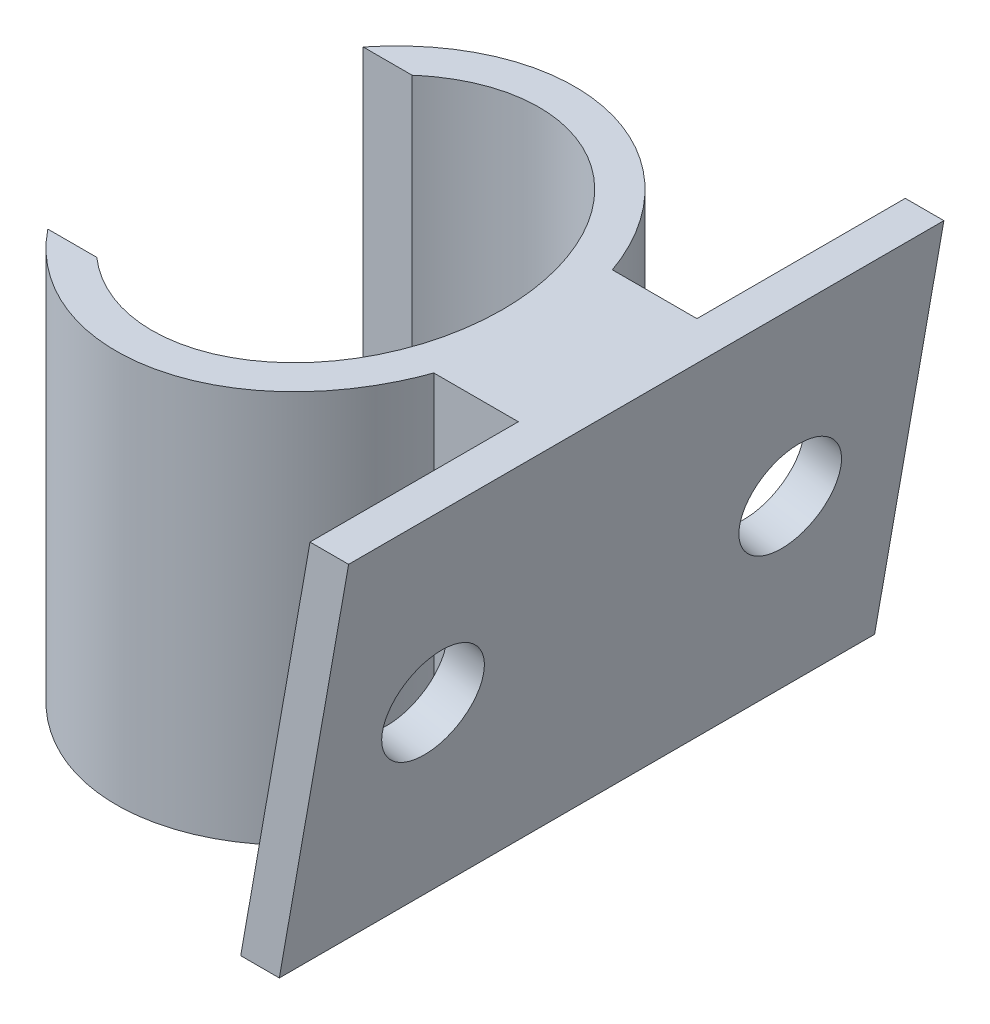
ISO-10303-21;
HEADER;
FILE_DESCRIPTION(('STEP AP214'),'2;1');
FILE_NAME('part.step','',(''),(''),'','','');
FILE_SCHEMA(('AUTOMOTIVE_DESIGN { 1 0 10303 214 1 1 1 1 }'));
ENDSEC;
DATA;
#1=APPLICATION_CONTEXT('core data for automotive mechanical design processes');
#2=APPLICATION_PROTOCOL_DEFINITION('international standard','automotive_design',2000,#1);
#3=PRODUCT_CONTEXT('',#1,'mechanical');
#4=PRODUCT('Part','Part','',(#3));
#5=PRODUCT_RELATED_PRODUCT_CATEGORY('part','',(#4));
#6=PRODUCT_DEFINITION_FORMATION('','',#4);
#7=PRODUCT_DEFINITION_CONTEXT('part definition',#1,'design');
#8=PRODUCT_DEFINITION('design','',#6,#7);
#9=PRODUCT_DEFINITION_SHAPE('','',#8);
#10=(LENGTH_UNIT() NAMED_UNIT(*) SI_UNIT(.MILLI.,.METRE.));
#11=(NAMED_UNIT(*) PLANE_ANGLE_UNIT() SI_UNIT($,.RADIAN.));
#12=(NAMED_UNIT(*) SI_UNIT($,.STERADIAN.) SOLID_ANGLE_UNIT());
#13=UNCERTAINTY_MEASURE_WITH_UNIT(LENGTH_MEASURE(1.E-05),#10,'distance_accuracy_value','');
#14=(GEOMETRIC_REPRESENTATION_CONTEXT(3) GLOBAL_UNCERTAINTY_ASSIGNED_CONTEXT((#13)) GLOBAL_UNIT_ASSIGNED_CONTEXT((#10,
#11,#12)) REPRESENTATION_CONTEXT('',''));
#15=CARTESIAN_POINT('',(0.,0.,0.));
#16=DIRECTION('',(0.,0.,1.));
#17=DIRECTION('',(1.,0.,0.));
#18=AXIS2_PLACEMENT_3D('',#15,#16,#17);
#19=CARTESIAN_POINT('',(13.6262926810581,0.,7.5));
#20=DIRECTION('',(0.,0.,1.));
#21=DIRECTION('',(1.,0.,0.));
#22=AXIS2_PLACEMENT_3D('',#19,#20,#21);
#23=PLANE('',#22);
#24=DIRECTION('',(1.,0.,0.));
#25=VECTOR('',#24,1.);
#26=CARTESIAN_POINT('',(13.6262926810581,0.,7.5));
#27=LINE('',#26,#25);
#28=CARTESIAN_POINT('',(14.9198723404759,0.,7.5));
#29=VERTEX_POINT('',#28);
#30=CARTESIAN_POINT('',(16.2,2.03165817409602E-13,7.5));
#31=VERTEX_POINT('',#30);
#32=EDGE_CURVE('E200',#29,#31,#27,.T.);
#33=ORIENTED_EDGE('',*,*,#32,.T.);
#34=DIRECTION('',(0.173648177666924,0.984807753012209,0.));
#35=VECTOR('',#34,1.);
#36=CARTESIAN_POINT('',(16.2,2.03165817409602E-13,7.5));
#37=LINE('',#36,#35);
#38=CARTESIAN_POINT('',(22.0187903633791,33.,7.5));
#39=VERTEX_POINT('',#38);
#40=EDGE_CURVE('E157',#31,#39,#37,.T.);
#41=ORIENTED_EDGE('',*,*,#40,.T.);
#42=DIRECTION('',(1.,0.,0.));
#43=VECTOR('',#42,1.);
#44=CARTESIAN_POINT('',(13.6262926810581,33.,7.5));
#45=LINE('',#44,#43);
#46=CARTESIAN_POINT('',(14.9198723404759,33.,7.5));
#47=VERTEX_POINT('',#46);
#48=EDGE_CURVE('E142',#47,#39,#45,.T.);
#49=ORIENTED_EDGE('',*,*,#48,.F.);
#50=DIRECTION('',(0.,-1.,0.));
#51=VECTOR('',#50,1.);
#52=CARTESIAN_POINT('',(14.9198723404759,33.,7.5));
#53=LINE('',#52,#51);
#54=EDGE_CURVE('E11',#29,#47,#53,.F.);
#55=ORIENTED_EDGE('',*,*,#54,.F.);
#56=EDGE_LOOP('',(#33,#41,#49,#55));
#57=FACE_BOUND('',#56,.T.);
#58=ADVANCED_FACE('F39',(#57),#23,.T.);
#59=CARTESIAN_POINT('',(17.8184577548668,0.,-7.5));
#60=DIRECTION('',(0.,0.,-1.));
#61=DIRECTION('',(-1.,0.,0.));
#62=AXIS2_PLACEMENT_3D('',#59,#60,#61);
#63=PLANE('',#62);
#64=DIRECTION('',(-1.,0.,0.));
#65=VECTOR('',#64,1.);
#66=CARTESIAN_POINT('',(17.8184577548668,33.,-7.5));
#67=LINE('',#66,#65);
#68=CARTESIAN_POINT('',(22.0187903633796,33.,-7.5));
#69=VERTEX_POINT('',#68);
#70=CARTESIAN_POINT('',(14.9198723404759,33.,-7.5));
#71=VERTEX_POINT('',#70);
#72=EDGE_CURVE('E134',#69,#71,#67,.T.);
#73=ORIENTED_EDGE('',*,*,#72,.F.);
#74=DIRECTION('',(-0.173648177666938,-0.984807753012207,0.));
#75=VECTOR('',#74,1.);
#76=CARTESIAN_POINT('',(16.2,2.03165817409602E-13,-7.5));
#77=LINE('',#76,#75);
#78=CARTESIAN_POINT('',(16.2,2.03165817409602E-13,-7.5));
#79=VERTEX_POINT('',#78);
#80=EDGE_CURVE('E136',#69,#79,#77,.T.);
#81=ORIENTED_EDGE('',*,*,#80,.T.);
#82=DIRECTION('',(-1.,0.,0.));
#83=VECTOR('',#82,1.);
#84=CARTESIAN_POINT('',(17.8184577548668,0.,-7.5));
#85=LINE('',#84,#83);
#86=CARTESIAN_POINT('',(14.9198723404759,0.,-7.5));
#87=VERTEX_POINT('',#86);
#88=EDGE_CURVE('E197',#79,#87,#85,.T.);
#89=ORIENTED_EDGE('',*,*,#88,.T.);
#90=DIRECTION('',(0.,-1.,0.));
#91=VECTOR('',#90,1.);
#92=CARTESIAN_POINT('',(14.9198723404759,33.,-7.5));
#93=LINE('',#92,#91);
#94=EDGE_CURVE('E50',#71,#87,#93,.T.);
#95=ORIENTED_EDGE('',*,*,#94,.F.);
#96=EDGE_LOOP('',(#73,#81,#89,#95));
#97=FACE_BOUND('',#96,.T.);
#98=ADVANCED_FACE('F135',(#97),#63,.T.);
#99=CARTESIAN_POINT('',(0.,33.,0.));
#100=DIRECTION('',(0.,1.,0.));
#101=DIRECTION('',(0.,0.,1.));
#102=AXIS2_PLACEMENT_3D('',#99,#100,#101);
#103=ELLIPSE('',#102,19.25,16.2);
#104=DIRECTION('',(0.,-1.,0.));
#105=VECTOR('',#104,1.);
#106=SURFACE_OF_LINEAR_EXTRUSION('',#103,#105);
#107=CARTESIAN_POINT('',(0.,0.,0.));
#108=DIRECTION('',(0.,1.,0.));
#109=DIRECTION('',(0.,0.,1.));
#110=AXIS2_PLACEMENT_3D('',#107,#108,#109);
#111=ELLIPSE('',#110,19.25,16.2);
#112=CARTESIAN_POINT('',(-11.7555055635405,0.,13.2452627548072));
#113=VERTEX_POINT('',#112);
#114=EDGE_CURVE('E291',#113,#29,#111,.T.);
#115=ORIENTED_EDGE('',*,*,#114,.T.);
#116=ORIENTED_EDGE('',*,*,#54,.T.);
#117=CARTESIAN_POINT('',(-11.7555055635405,33.,13.2452627548072));
#118=VERTEX_POINT('',#117);
#119=EDGE_CURVE('E296',#118,#47,#103,.T.);
#120=ORIENTED_EDGE('',*,*,#119,.F.);
#121=DIRECTION('',(0.,-1.,0.));
#122=VECTOR('',#121,1.);
#123=CARTESIAN_POINT('',(-11.7555055635405,33.,13.2452627548072));
#124=LINE('',#123,#122);
#125=EDGE_CURVE('E232',#118,#113,#124,.T.);
#126=ORIENTED_EDGE('',*,*,#125,.T.);
#127=EDGE_LOOP('',(#115,#116,#120,#126));
#128=FACE_BOUND('',#127,.T.);
#129=ADVANCED_FACE('F253',(#128),#106,.F.);
#130=CARTESIAN_POINT('',(0.,33.,0.));
#131=DIRECTION('',(0.,1.,0.));
#132=DIRECTION('',(0.,0.,1.));
#133=AXIS2_PLACEMENT_3D('',#130,#131,#132);
#134=PLANE('',#133);
#135=DIRECTION('',(0.,0.,-1.));
#136=VECTOR('',#135,1.);
#137=CARTESIAN_POINT('',(22.0187903633796,33.,-7.5));
#138=LINE('',#137,#136);
#139=CARTESIAN_POINT('',(22.0187903633796,33.,-25.));
#140=VERTEX_POINT('',#139);
#141=EDGE_CURVE('E58',#69,#140,#138,.T.);
#142=ORIENTED_EDGE('',*,*,#141,.F.);
#143=ORIENTED_EDGE('',*,*,#72,.T.);
#144=CARTESIAN_POINT('',(-11.7555055635405,33.,-13.2452627548072));
#145=VERTEX_POINT('',#144);
#146=EDGE_CURVE('E287',#71,#145,#103,.T.);
#147=ORIENTED_EDGE('',*,*,#146,.T.);
#148=DIRECTION('',(-1.,0.,0.));
#149=VECTOR('',#148,1.);
#150=CARTESIAN_POINT('',(-7.64715601697513,33.,-13.2452627548072));
#151=LINE('',#150,#149);
#152=CARTESIAN_POINT('',(-7.64715601697513,33.,-13.2452627548072));
#153=VERTEX_POINT('',#152);
#154=EDGE_CURVE('E203',#153,#145,#151,.T.);
#155=ORIENTED_EDGE('',*,*,#154,.F.);
#156=CARTESIAN_POINT('',(0.,33.,0.));
#157=DIRECTION('',(0.,1.,0.));
#158=DIRECTION('',(0.,0.,1.));
#159=AXIS2_PLACEMENT_3D('',#156,#157,#158);
#160=ELLIPSE('',#159,16.25,13.2);
#161=CARTESIAN_POINT('',(-7.64715601697507,33.,13.2452627548072));
#162=VERTEX_POINT('',#161);
#163=EDGE_CURVE('E237',#162,#153,#160,.T.);
#164=ORIENTED_EDGE('',*,*,#163,.F.);
#165=DIRECTION('',(1.,0.,0.));
#166=VECTOR('',#165,1.);
#167=CARTESIAN_POINT('',(-7.64715601697507,33.,13.2452627548072));
#168=LINE('',#167,#166);
#169=EDGE_CURVE('E212',#118,#162,#168,.T.);
#170=ORIENTED_EDGE('',*,*,#169,.F.);
#171=ORIENTED_EDGE('',*,*,#119,.T.);
#172=ORIENTED_EDGE('',*,*,#48,.T.);
#173=DIRECTION('',(0.,0.,1.));
#174=VECTOR('',#173,1.);
#175=CARTESIAN_POINT('',(22.0187903633791,33.,7.5));
#176=LINE('',#175,#174);
#177=CARTESIAN_POINT('',(22.0187903633791,33.,25.));
#178=VERTEX_POINT('',#177);
#179=EDGE_CURVE('E163',#39,#178,#176,.T.);
#180=ORIENTED_EDGE('',*,*,#179,.T.);
#181=DIRECTION('',(-1.,0.,0.));
#182=VECTOR('',#181,1.);
#183=CARTESIAN_POINT('',(16.2,33.,25.));
#184=LINE('',#183,#182);
#185=CARTESIAN_POINT('',(25.2620960188586,33.,25.));
#186=VERTEX_POINT('',#185);
#187=EDGE_CURVE('E188',#186,#178,#184,.T.);
#188=ORIENTED_EDGE('',*,*,#187,.F.);
#189=DIRECTION('',(0.,0.,-1.));
#190=VECTOR('',#189,1.);
#191=CARTESIAN_POINT('',(25.2620960188586,33.,25.));
#192=LINE('',#191,#190);
#193=CARTESIAN_POINT('',(25.2620960188586,33.,-25.));
#194=VERTEX_POINT('',#193);
#195=EDGE_CURVE('E182',#186,#194,#192,.T.);
#196=ORIENTED_EDGE('',*,*,#195,.T.);
#197=DIRECTION('',(1.,0.,0.));
#198=VECTOR('',#197,1.);
#199=CARTESIAN_POINT('',(16.2,33.,-25.));
#200=LINE('',#199,#198);
#201=EDGE_CURVE('E152',#140,#194,#200,.T.);
#202=ORIENTED_EDGE('',*,*,#201,.F.);
#203=EDGE_LOOP('',(#142,#143,#147,#155,#164,#170,#171,#172,#180,#188,#196,#202));
#204=FACE_BOUND('',#203,.T.);
#205=ADVANCED_FACE('F150',(#204),#134,.T.);
#206=CARTESIAN_POINT('',(0.,0.,0.));
#207=DIRECTION('',(0.,1.,0.));
#208=DIRECTION('',(0.,0.,1.));
#209=AXIS2_PLACEMENT_3D('',#206,#207,#208);
#210=PLANE('',#209);
#211=ORIENTED_EDGE('',*,*,#88,.F.);
#212=DIRECTION('',(0.,0.,1.));
#213=VECTOR('',#212,1.);
#214=CARTESIAN_POINT('',(16.2,0.,-30.));
#215=LINE('',#214,#213);
#216=CARTESIAN_POINT('',(16.2,2.03165817409602E-13,-25.));
#217=VERTEX_POINT('',#216);
#218=EDGE_CURVE('E143',#217,#79,#215,.T.);
#219=ORIENTED_EDGE('',*,*,#218,.F.);
#220=DIRECTION('',(-1.,0.,0.));
#221=VECTOR('',#220,1.);
#222=CARTESIAN_POINT('',(16.2,2.03165817409602E-13,-25.));
#223=LINE('',#222,#221);
#224=CARTESIAN_POINT('',(19.4433056554793,2.03721588210026E-13,-25.));
#225=VERTEX_POINT('',#224);
#226=EDGE_CURVE('E66',#225,#217,#223,.T.);
#227=ORIENTED_EDGE('',*,*,#226,.F.);
#228=DIRECTION('',(0.,0.,1.));
#229=VECTOR('',#228,1.);
#230=CARTESIAN_POINT('',(19.4433056554793,0.,-25.));
#231=LINE('',#230,#229);
#232=CARTESIAN_POINT('',(19.4433056554793,0.,25.));
#233=VERTEX_POINT('',#232);
#234=EDGE_CURVE('E171',#225,#233,#231,.T.);
#235=ORIENTED_EDGE('',*,*,#234,.T.);
#236=DIRECTION('',(-1.,0.,0.));
#237=VECTOR('',#236,1.);
#238=CARTESIAN_POINT('',(16.2,2.03165817409602E-13,25.));
#239=LINE('',#238,#237);
#240=CARTESIAN_POINT('',(16.2,2.03165817409602E-13,25.));
#241=VERTEX_POINT('',#240);
#242=EDGE_CURVE('E168',#233,#241,#239,.T.);
#243=ORIENTED_EDGE('',*,*,#242,.T.);
#244=EDGE_CURVE('E191',#31,#241,#215,.T.);
#245=ORIENTED_EDGE('',*,*,#244,.F.);
#246=ORIENTED_EDGE('',*,*,#32,.F.);
#247=ORIENTED_EDGE('',*,*,#114,.F.);
#248=DIRECTION('',(1.,0.,0.));
#249=VECTOR('',#248,1.);
#250=CARTESIAN_POINT('',(-7.64715601697507,0.,13.2452627548072));
#251=LINE('',#250,#249);
#252=CARTESIAN_POINT('',(-7.64715601697507,0.,13.2452627548072));
#253=VERTEX_POINT('',#252);
#254=EDGE_CURVE('E211',#113,#253,#251,.T.);
#255=ORIENTED_EDGE('',*,*,#254,.T.);
#256=CARTESIAN_POINT('',(0.,0.,0.));
#257=DIRECTION('',(0.,1.,0.));
#258=DIRECTION('',(0.,0.,1.));
#259=AXIS2_PLACEMENT_3D('',#256,#257,#258);
#260=ELLIPSE('',#259,16.25,13.2);
#261=CARTESIAN_POINT('',(-7.64715601697513,0.,-13.2452627548072));
#262=VERTEX_POINT('',#261);
#263=EDGE_CURVE('E236',#253,#262,#260,.T.);
#264=ORIENTED_EDGE('',*,*,#263,.T.);
#265=DIRECTION('',(-1.,0.,0.));
#266=VECTOR('',#265,1.);
#267=CARTESIAN_POINT('',(-7.64715601697513,0.,-13.2452627548072));
#268=LINE('',#267,#266);
#269=CARTESIAN_POINT('',(-11.7555055635405,0.,-13.2452627548072));
#270=VERTEX_POINT('',#269);
#271=EDGE_CURVE('E207',#262,#270,#268,.T.);
#272=ORIENTED_EDGE('',*,*,#271,.T.);
#273=EDGE_CURVE('E242',#87,#270,#111,.T.);
#274=ORIENTED_EDGE('',*,*,#273,.F.);
#275=EDGE_LOOP('',(#211,#219,#227,#235,#243,#245,#246,#247,#255,#264,#272,#274));
#276=FACE_BOUND('',#275,.T.);
#277=ADVANCED_FACE('F252',(#276),#210,.F.);
#278=ORIENTED_EDGE('',*,*,#146,.F.);
#279=ORIENTED_EDGE('',*,*,#94,.T.);
#280=ORIENTED_EDGE('',*,*,#273,.T.);
#281=DIRECTION('',(0.,-1.,0.));
#282=VECTOR('',#281,1.);
#283=CARTESIAN_POINT('',(-11.7555055635405,33.,-13.2452627548072));
#284=LINE('',#283,#282);
#285=EDGE_CURVE('E226',#270,#145,#284,.F.);
#286=ORIENTED_EDGE('',*,*,#285,.T.);
#287=EDGE_LOOP('',(#278,#279,#280,#286));
#288=FACE_BOUND('',#287,.T.);
#289=ADVANCED_FACE('F41',(#288),#106,.F.);
#290=DIRECTION('',(0.,-1.,0.));
#291=VECTOR('',#290,1.);
#292=SURFACE_OF_LINEAR_EXTRUSION('',#160,#291);
#293=DIRECTION('',(0.,1.,0.));
#294=VECTOR('',#293,1.);
#295=CARTESIAN_POINT('',(-7.64715601697507,0.,13.2452627548072));
#296=LINE('',#295,#294);
#297=EDGE_CURVE('E222',#253,#162,#296,.T.);
#298=ORIENTED_EDGE('',*,*,#297,.T.);
#299=ORIENTED_EDGE('',*,*,#163,.T.);
#300=DIRECTION('',(0.,1.,0.));
#301=VECTOR('',#300,1.);
#302=CARTESIAN_POINT('',(-7.64715601697513,0.,-13.2452627548072));
#303=LINE('',#302,#301);
#304=EDGE_CURVE('E216',#262,#153,#303,.T.);
#305=ORIENTED_EDGE('',*,*,#304,.F.);
#306=ORIENTED_EDGE('',*,*,#263,.F.);
#307=EDGE_LOOP('',(#298,#299,#305,#306));
#308=FACE_BOUND('',#307,.T.);
#309=ADVANCED_FACE('F244',(#308),#292,.T.);
#310=CARTESIAN_POINT('',(-7.64715601697513,0.,-13.2452627548072));
#311=DIRECTION('',(0.,0.,-1.));
#312=DIRECTION('',(-1.,0.,0.));
#313=AXIS2_PLACEMENT_3D('',#310,#311,#312);
#314=PLANE('',#313);
#315=ORIENTED_EDGE('',*,*,#271,.F.);
#316=ORIENTED_EDGE('',*,*,#304,.T.);
#317=ORIENTED_EDGE('',*,*,#154,.T.);
#318=ORIENTED_EDGE('',*,*,#285,.F.);
#319=EDGE_LOOP('',(#315,#316,#317,#318));
#320=FACE_BOUND('',#319,.T.);
#321=ADVANCED_FACE('F248',(#320),#314,.F.);
#322=CARTESIAN_POINT('',(-7.64715601697507,0.,13.2452627548072));
#323=DIRECTION('',(0.,0.,1.));
#324=DIRECTION('',(1.,0.,0.));
#325=AXIS2_PLACEMENT_3D('',#322,#323,#324);
#326=PLANE('',#325);
#327=ORIENTED_EDGE('',*,*,#169,.T.);
#328=ORIENTED_EDGE('',*,*,#297,.F.);
#329=ORIENTED_EDGE('',*,*,#254,.F.);
#330=ORIENTED_EDGE('',*,*,#125,.F.);
#331=EDGE_LOOP('',(#327,#328,#329,#330));
#332=FACE_BOUND('',#331,.T.);
#333=ADVANCED_FACE('F269',(#332),#326,.F.);
#334=CARTESIAN_POINT('',(16.2,-3.,25.));
#335=DIRECTION('',(0.,0.,-1.));
#336=DIRECTION('',(-1.,0.,0.));
#337=AXIS2_PLACEMENT_3D('',#334,#335,#336);
#338=PLANE('',#337);
#339=ORIENTED_EDGE('',*,*,#187,.T.);
#340=DIRECTION('',(0.173648177666924,0.984807753012209,0.));
#341=VECTOR('',#340,1.);
#342=CARTESIAN_POINT('',(16.2,2.03165817409602E-13,25.));
#343=LINE('',#342,#341);
#344=EDGE_CURVE('E154',#241,#178,#343,.T.);
#345=ORIENTED_EDGE('',*,*,#344,.F.);
#346=ORIENTED_EDGE('',*,*,#242,.F.);
#347=DIRECTION('',(-0.17364817766693,-0.984807753012208,0.));
#348=VECTOR('',#347,1.);
#349=CARTESIAN_POINT('',(25.0728739543785,31.9268683458431,25.));
#350=LINE('',#349,#348);
#351=EDGE_CURVE('E178',#186,#233,#350,.T.);
#352=ORIENTED_EDGE('',*,*,#351,.F.);
#353=EDGE_LOOP('',(#339,#345,#346,#352));
#354=FACE_BOUND('',#353,.T.);
#355=ADVANCED_FACE('F267',(#354),#338,.F.);
#356=CARTESIAN_POINT('',(16.2,-3.,-25.));
#357=DIRECTION('',(0.,0.,1.));
#358=DIRECTION('',(1.,0.,0.));
#359=AXIS2_PLACEMENT_3D('',#356,#357,#358);
#360=PLANE('',#359);
#361=ORIENTED_EDGE('',*,*,#226,.T.);
#362=DIRECTION('',(-0.173648177666938,-0.984807753012207,0.));
#363=VECTOR('',#362,1.);
#364=CARTESIAN_POINT('',(16.2,2.03165817409602E-13,-25.));
#365=LINE('',#364,#363);
#366=EDGE_CURVE('E147',#140,#217,#365,.T.);
#367=ORIENTED_EDGE('',*,*,#366,.F.);
#368=ORIENTED_EDGE('',*,*,#201,.T.);
#369=DIRECTION('',(-0.173648177666931,-0.984807753012208,0.));
#370=VECTOR('',#369,1.);
#371=CARTESIAN_POINT('',(19.3455080234432,-0.554637932567786,-25.));
#372=LINE('',#371,#370);
#373=EDGE_CURVE('E177',#194,#225,#372,.T.);
#374=ORIENTED_EDGE('',*,*,#373,.T.);
#375=EDGE_LOOP('',(#361,#367,#368,#374));
#376=FACE_BOUND('',#375,.T.);
#377=ADVANCED_FACE('F276',(#376),#360,.F.);
#378=CARTESIAN_POINT('',(19.3455080234432,-0.554637932567786,25.));
#379=DIRECTION('',(0.984807753012208,-0.173648177666931,0.));
#380=DIRECTION('',(0.173648177666931,0.984807753012208,0.));
#381=AXIS2_PLACEMENT_3D('',#378,#379,#380);
#382=PLANE('',#381);
#383=CARTESIAN_POINT('',(22.3526208020492,16.4995460982805,15.));
#384=DIRECTION('',(0.984807753012208,-0.173648177666931,0.));
#385=DIRECTION('',(0.173648177666931,0.984807753012208,0.));
#386=AXIS2_PLACEMENT_3D('',#383,#384,#385);
#387=CIRCLE('',#386,4.25);
#388=CARTESIAN_POINT('',(23.0906255571337,20.6849790485824,15.));
#389=VERTEX_POINT('',#388);
#390=EDGE_CURVE('E302',#389,#389,#387,.T.);
#391=ORIENTED_EDGE('',*,*,#390,.F.);
#392=EDGE_LOOP('',(#391));
#393=FACE_BOUND('',#392,.T.);
#394=CARTESIAN_POINT('',(22.3526208020492,16.4995460982805,-15.));
#395=DIRECTION('',(0.984807753012208,-0.173648177666931,0.));
#396=DIRECTION('',(0.173648177666931,0.984807753012208,0.));
#397=AXIS2_PLACEMENT_3D('',#394,#395,#396);
#398=CIRCLE('',#397,4.24999999999999);
#399=CARTESIAN_POINT('',(23.0906255571337,20.6849790485824,-15.));
#400=VERTEX_POINT('',#399);
#401=EDGE_CURVE('E309',#400,#400,#398,.T.);
#402=ORIENTED_EDGE('',*,*,#401,.F.);
#403=EDGE_LOOP('',(#402));
#404=FACE_BOUND('',#403,.T.);
#405=ORIENTED_EDGE('',*,*,#234,.F.);
#406=ORIENTED_EDGE('',*,*,#373,.F.);
#407=ORIENTED_EDGE('',*,*,#195,.F.);
#408=ORIENTED_EDGE('',*,*,#351,.T.);
#409=EDGE_LOOP('',(#405,#406,#407,#408));
#410=FACE_BOUND('',#409,.T.);
#411=ADVANCED_FACE('F321',(#393,#404,#410),#382,.T.);
#412=CARTESIAN_POINT('',(16.2,2.03165817409602E-13,7.5));
#413=DIRECTION('',(0.984807753012209,-0.173648177666924,0.));
#414=DIRECTION('',(0.173648177666924,0.984807753012209,0.));
#415=AXIS2_PLACEMENT_3D('',#412,#413,#414);
#416=PLANE('',#415);
#417=CARTESIAN_POINT('',(19.2071127786059,17.0541840308485,15.));
#418=DIRECTION('',(0.984807753012209,-0.173648177666924,0.));
#419=DIRECTION('',(0.173648177666924,0.984807753012209,0.));
#420=AXIS2_PLACEMENT_3D('',#417,#418,#419);
#421=CIRCLE('',#420,4.25);
#422=CARTESIAN_POINT('',(19.9451175336903,21.2396169811504,15.));
#423=VERTEX_POINT('',#422);
#424=EDGE_CURVE('E44',#423,#423,#421,.T.);
#425=ORIENTED_EDGE('',*,*,#424,.T.);
#426=EDGE_LOOP('',(#425));
#427=FACE_BOUND('',#426,.T.);
#428=ORIENTED_EDGE('',*,*,#344,.T.);
#429=ORIENTED_EDGE('',*,*,#179,.F.);
#430=ORIENTED_EDGE('',*,*,#40,.F.);
#431=ORIENTED_EDGE('',*,*,#244,.T.);
#432=EDGE_LOOP('',(#428,#429,#430,#431));
#433=FACE_BOUND('',#432,.T.);
#434=ADVANCED_FACE('F324',(#427,#433),#416,.F.);
#435=CARTESIAN_POINT('',(16.2,2.03165817409602E-13,-7.5));
#436=DIRECTION('',(0.984807753012207,-0.173648177666938,0.));
#437=DIRECTION('',(0.173648177666938,0.984807753012207,0.));
#438=AXIS2_PLACEMENT_3D('',#435,#436,#437);
#439=PLANE('',#438);
#440=CARTESIAN_POINT('',(19.2071127786062,17.0541840308485,-15.));
#441=DIRECTION('',(0.984807753012207,-0.173648177666938,0.));
#442=DIRECTION('',(0.173648177666938,0.984807753012207,0.));
#443=AXIS2_PLACEMENT_3D('',#440,#441,#442);
#444=CIRCLE('',#443,4.24999999999999);
#445=CARTESIAN_POINT('',(19.9451175336906,21.2396169811503,-15.));
#446=VERTEX_POINT('',#445);
#447=EDGE_CURVE('E299',#446,#446,#444,.T.);
#448=ORIENTED_EDGE('',*,*,#447,.T.);
#449=EDGE_LOOP('',(#448));
#450=FACE_BOUND('',#449,.T.);
#451=ORIENTED_EDGE('',*,*,#366,.T.);
#452=ORIENTED_EDGE('',*,*,#218,.T.);
#453=ORIENTED_EDGE('',*,*,#80,.F.);
#454=ORIENTED_EDGE('',*,*,#141,.T.);
#455=EDGE_LOOP('',(#451,#452,#453,#454));
#456=FACE_BOUND('',#455,.T.);
#457=ADVANCED_FACE('F145',(#450,#456),#439,.F.);
#458=CARTESIAN_POINT('',(18.4133897900004,17.1941388089482,-15.));
#459=DIRECTION('',(0.984807753012208,-0.173648177666931,0.));
#460=DIRECTION('',(0.173648177666931,0.984807753012208,0.));
#461=AXIS2_PLACEMENT_3D('',#458,#459,#460);
#462=CYLINDRICAL_SURFACE('',#461,4.24999999999999);
#463=ORIENTED_EDGE('',*,*,#401,.T.);
#464=EDGE_LOOP('',(#463));
#465=FACE_BOUND('',#464,.T.);
#466=ORIENTED_EDGE('',*,*,#447,.F.);
#467=EDGE_LOOP('',(#466));
#468=FACE_BOUND('',#467,.T.);
#469=ADVANCED_FACE('F318',(#465,#468),#462,.F.);
#470=CARTESIAN_POINT('',(18.4133897900004,17.1941388089482,15.));
#471=DIRECTION('',(0.984807753012208,-0.173648177666931,0.));
#472=DIRECTION('',(0.173648177666931,0.984807753012208,0.));
#473=AXIS2_PLACEMENT_3D('',#470,#471,#472);
#474=CYLINDRICAL_SURFACE('',#473,4.25);
#475=ORIENTED_EDGE('',*,*,#390,.T.);
#476=EDGE_LOOP('',(#475));
#477=FACE_BOUND('',#476,.T.);
#478=ORIENTED_EDGE('',*,*,#424,.F.);
#479=EDGE_LOOP('',(#478));
#480=FACE_BOUND('',#479,.T.);
#481=ADVANCED_FACE('F344',(#477,#480),#474,.F.);
#482=CLOSED_SHELL('',(#58,#98,#129,#205,#277,#289,#309,#321,#333,#355,#377,#411,#434,#457,#469,#481));
#483=MANIFOLD_SOLID_BREP('B2',#482);
#484=ADVANCED_BREP_SHAPE_REPRESENTATION('',(#18,#483),#14);
#485=SHAPE_DEFINITION_REPRESENTATION(#9,#484);
ENDSEC;
END-ISO-10303-21;
